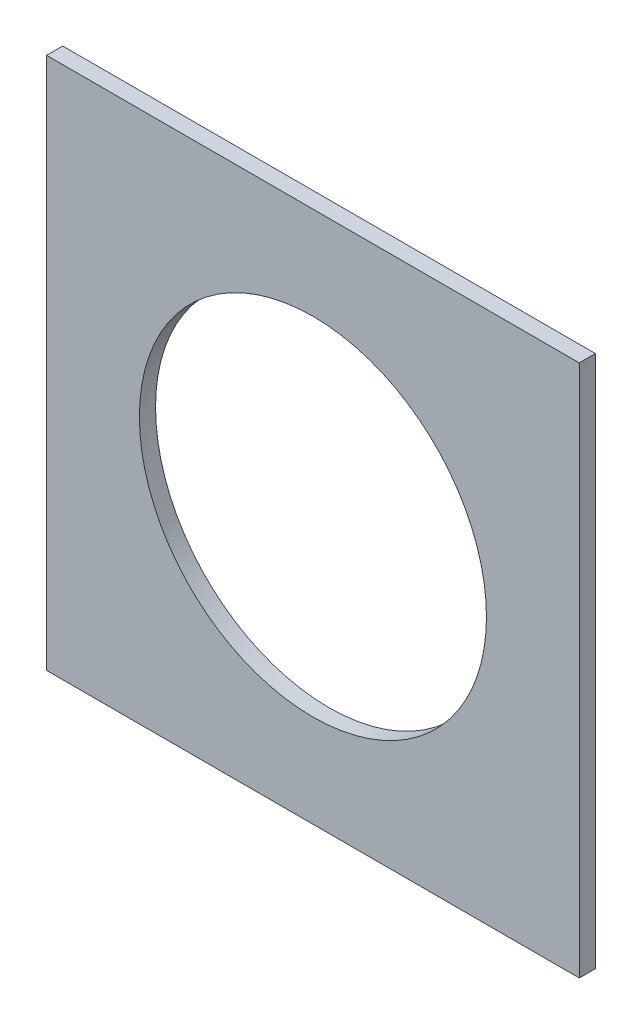
ISO-10303-21;
HEADER;
FILE_DESCRIPTION(('STEP AP214'),'2;1');
FILE_NAME('part.step','',(''),(''),'','','');
FILE_SCHEMA(('AUTOMOTIVE_DESIGN { 1 0 10303 214 1 1 1 1 }'));
ENDSEC;
DATA;
#1=APPLICATION_CONTEXT('core data for automotive mechanical design processes');
#2=APPLICATION_PROTOCOL_DEFINITION('international standard','automotive_design',2000,#1);
#3=PRODUCT_CONTEXT('',#1,'mechanical');
#4=PRODUCT('Part','Part','',(#3));
#5=PRODUCT_RELATED_PRODUCT_CATEGORY('part','',(#4));
#6=PRODUCT_DEFINITION_FORMATION('','',#4);
#7=PRODUCT_DEFINITION_CONTEXT('part definition',#1,'design');
#8=PRODUCT_DEFINITION('design','',#6,#7);
#9=PRODUCT_DEFINITION_SHAPE('','',#8);
#10=(LENGTH_UNIT() NAMED_UNIT(*) SI_UNIT(.MILLI.,.METRE.));
#11=(NAMED_UNIT(*) PLANE_ANGLE_UNIT() SI_UNIT($,.RADIAN.));
#12=(NAMED_UNIT(*) SI_UNIT($,.STERADIAN.) SOLID_ANGLE_UNIT());
#13=UNCERTAINTY_MEASURE_WITH_UNIT(LENGTH_MEASURE(1.E-05),#10,'distance_accuracy_value','');
#14=(GEOMETRIC_REPRESENTATION_CONTEXT(3) GLOBAL_UNCERTAINTY_ASSIGNED_CONTEXT((#13)) GLOBAL_UNIT_ASSIGNED_CONTEXT((#10,
#11,#12)) REPRESENTATION_CONTEXT('',''));
#15=CARTESIAN_POINT('',(0.,0.,0.));
#16=DIRECTION('',(0.,0.,1.));
#17=DIRECTION('',(1.,0.,0.));
#18=AXIS2_PLACEMENT_3D('',#15,#16,#17);
#19=CARTESIAN_POINT('',(165.,-165.,-10.));
#20=DIRECTION('',(1.,0.,0.));
#21=DIRECTION('',(0.,0.,-1.));
#22=AXIS2_PLACEMENT_3D('',#19,#20,#21);
#23=PLANE('',#22);
#24=DIRECTION('',(0.,1.,0.));
#25=VECTOR('',#24,1.);
#26=CARTESIAN_POINT('',(165.,-165.,0.));
#27=LINE('',#26,#25);
#28=CARTESIAN_POINT('',(165.,-165.,0.));
#29=VERTEX_POINT('',#28);
#30=CARTESIAN_POINT('',(165.,165.,0.));
#31=VERTEX_POINT('',#30);
#32=EDGE_CURVE('E99',#29,#31,#27,.T.);
#33=ORIENTED_EDGE('',*,*,#32,.F.);
#34=DIRECTION('',(0.,0.,1.));
#35=VECTOR('',#34,1.);
#36=CARTESIAN_POINT('',(165.,-165.,-10.));
#37=LINE('',#36,#35);
#38=CARTESIAN_POINT('',(165.,-165.,-10.));
#39=VERTEX_POINT('',#38);
#40=EDGE_CURVE('E11',#39,#29,#37,.T.);
#41=ORIENTED_EDGE('',*,*,#40,.F.);
#42=DIRECTION('',(0.,1.,0.));
#43=VECTOR('',#42,1.);
#44=CARTESIAN_POINT('',(165.,-165.,-10.));
#45=LINE('',#44,#43);
#46=CARTESIAN_POINT('',(165.,165.,-10.));
#47=VERTEX_POINT('',#46);
#48=EDGE_CURVE('E92',#39,#47,#45,.T.);
#49=ORIENTED_EDGE('',*,*,#48,.T.);
#50=DIRECTION('',(0.,0.,1.));
#51=VECTOR('',#50,1.);
#52=CARTESIAN_POINT('',(165.,165.,-10.));
#53=LINE('',#52,#51);
#54=EDGE_CURVE('E37',#47,#31,#53,.T.);
#55=ORIENTED_EDGE('',*,*,#54,.T.);
#56=EDGE_LOOP('',(#33,#41,#49,#55));
#57=FACE_BOUND('',#56,.T.);
#58=ADVANCED_FACE('F34',(#57),#23,.T.);
#59=CARTESIAN_POINT('',(-165.,-165.,-10.));
#60=DIRECTION('',(0.,-1.,0.));
#61=DIRECTION('',(0.,0.,-1.));
#62=AXIS2_PLACEMENT_3D('',#59,#60,#61);
#63=PLANE('',#62);
#64=DIRECTION('',(1.,0.,0.));
#65=VECTOR('',#64,1.);
#66=CARTESIAN_POINT('',(-165.,-165.,0.));
#67=LINE('',#66,#65);
#68=CARTESIAN_POINT('',(-165.,-165.,0.));
#69=VERTEX_POINT('',#68);
#70=EDGE_CURVE('E94',#69,#29,#67,.T.);
#71=ORIENTED_EDGE('',*,*,#70,.F.);
#72=DIRECTION('',(0.,0.,1.));
#73=VECTOR('',#72,1.);
#74=CARTESIAN_POINT('',(-165.,-165.,-10.));
#75=LINE('',#74,#73);
#76=CARTESIAN_POINT('',(-165.,-165.,-10.));
#77=VERTEX_POINT('',#76);
#78=EDGE_CURVE('E43',#77,#69,#75,.T.);
#79=ORIENTED_EDGE('',*,*,#78,.F.);
#80=DIRECTION('',(1.,0.,0.));
#81=VECTOR('',#80,1.);
#82=CARTESIAN_POINT('',(-165.,-165.,-10.));
#83=LINE('',#82,#81);
#84=EDGE_CURVE('E89',#77,#39,#83,.T.);
#85=ORIENTED_EDGE('',*,*,#84,.T.);
#86=ORIENTED_EDGE('',*,*,#40,.T.);
#87=EDGE_LOOP('',(#71,#79,#85,#86));
#88=FACE_BOUND('',#87,.T.);
#89=ADVANCED_FACE('F110',(#88),#63,.T.);
#90=CARTESIAN_POINT('',(-165.,-165.,-10.));
#91=DIRECTION('',(-1.,0.,0.));
#92=DIRECTION('',(0.,0.,1.));
#93=AXIS2_PLACEMENT_3D('',#90,#91,#92);
#94=PLANE('',#93);
#95=DIRECTION('',(0.,-1.,0.));
#96=VECTOR('',#95,1.);
#97=CARTESIAN_POINT('',(-165.,-165.,0.));
#98=LINE('',#97,#96);
#99=CARTESIAN_POINT('',(-165.,165.,0.));
#100=VERTEX_POINT('',#99);
#101=EDGE_CURVE('E84',#100,#69,#98,.T.);
#102=ORIENTED_EDGE('',*,*,#101,.F.);
#103=DIRECTION('',(0.,0.,1.));
#104=VECTOR('',#103,1.);
#105=CARTESIAN_POINT('',(-165.,165.,-10.));
#106=LINE('',#105,#104);
#107=CARTESIAN_POINT('',(-165.,165.,-10.));
#108=VERTEX_POINT('',#107);
#109=EDGE_CURVE('E79',#108,#100,#106,.T.);
#110=ORIENTED_EDGE('',*,*,#109,.F.);
#111=DIRECTION('',(0.,-1.,0.));
#112=VECTOR('',#111,1.);
#113=CARTESIAN_POINT('',(-165.,-165.,-10.));
#114=LINE('',#113,#112);
#115=EDGE_CURVE('E82',#108,#77,#114,.T.);
#116=ORIENTED_EDGE('',*,*,#115,.T.);
#117=ORIENTED_EDGE('',*,*,#78,.T.);
#118=EDGE_LOOP('',(#102,#110,#116,#117));
#119=FACE_BOUND('',#118,.T.);
#120=ADVANCED_FACE('F81',(#119),#94,.T.);
#121=CARTESIAN_POINT('',(-165.,165.,-10.));
#122=DIRECTION('',(0.,1.,0.));
#123=DIRECTION('',(0.,0.,1.));
#124=AXIS2_PLACEMENT_3D('',#121,#122,#123);
#125=PLANE('',#124);
#126=DIRECTION('',(-1.,0.,0.));
#127=VECTOR('',#126,1.);
#128=CARTESIAN_POINT('',(-165.,165.,0.));
#129=LINE('',#128,#127);
#130=EDGE_CURVE('E102',#31,#100,#129,.T.);
#131=ORIENTED_EDGE('',*,*,#130,.F.);
#132=ORIENTED_EDGE('',*,*,#54,.F.);
#133=DIRECTION('',(-1.,0.,0.));
#134=VECTOR('',#133,1.);
#135=CARTESIAN_POINT('',(-165.,165.,-10.));
#136=LINE('',#135,#134);
#137=EDGE_CURVE('E88',#47,#108,#136,.T.);
#138=ORIENTED_EDGE('',*,*,#137,.T.);
#139=ORIENTED_EDGE('',*,*,#109,.T.);
#140=EDGE_LOOP('',(#131,#132,#138,#139));
#141=FACE_BOUND('',#140,.T.);
#142=ADVANCED_FACE('F91',(#141),#125,.T.);
#143=CARTESIAN_POINT('',(0.,0.,-10.));
#144=DIRECTION('',(0.,0.,-1.));
#145=DIRECTION('',(-1.,0.,0.));
#146=AXIS2_PLACEMENT_3D('',#143,#144,#145);
#147=PLANE('',#146);
#148=CARTESIAN_POINT('',(0.,0.,-10.));
#149=DIRECTION('',(0.,0.,1.));
#150=DIRECTION('',(1.,0.,0.));
#151=AXIS2_PLACEMENT_3D('',#148,#149,#150);
#152=CIRCLE('',#151,107.5);
#153=CARTESIAN_POINT('',(107.5,0.,-10.));
#154=VERTEX_POINT('',#153);
#155=EDGE_CURVE('E103',#154,#154,#152,.T.);
#156=ORIENTED_EDGE('',*,*,#155,.T.);
#157=EDGE_LOOP('',(#156));
#158=FACE_BOUND('',#157,.T.);
#159=ORIENTED_EDGE('',*,*,#48,.F.);
#160=ORIENTED_EDGE('',*,*,#84,.F.);
#161=ORIENTED_EDGE('',*,*,#115,.F.);
#162=ORIENTED_EDGE('',*,*,#137,.F.);
#163=EDGE_LOOP('',(#159,#160,#161,#162));
#164=FACE_BOUND('',#163,.T.);
#165=ADVANCED_FACE('F87',(#158,#164),#147,.T.);
#166=CARTESIAN_POINT('',(0.,0.,0.));
#167=DIRECTION('',(0.,0.,-1.));
#168=DIRECTION('',(-1.,0.,0.));
#169=AXIS2_PLACEMENT_3D('',#166,#167,#168);
#170=PLANE('',#169);
#171=CARTESIAN_POINT('',(0.,0.,0.));
#172=DIRECTION('',(0.,0.,1.));
#173=DIRECTION('',(1.,0.,0.));
#174=AXIS2_PLACEMENT_3D('',#171,#172,#173);
#175=CIRCLE('',#174,107.5);
#176=CARTESIAN_POINT('',(107.5,0.,0.));
#177=VERTEX_POINT('',#176);
#178=EDGE_CURVE('E140',#177,#177,#175,.T.);
#179=ORIENTED_EDGE('',*,*,#178,.F.);
#180=EDGE_LOOP('',(#179));
#181=FACE_BOUND('',#180,.T.);
#182=ORIENTED_EDGE('',*,*,#32,.T.);
#183=ORIENTED_EDGE('',*,*,#130,.T.);
#184=ORIENTED_EDGE('',*,*,#101,.T.);
#185=ORIENTED_EDGE('',*,*,#70,.T.);
#186=EDGE_LOOP('',(#182,#183,#184,#185));
#187=FACE_BOUND('',#186,.T.);
#188=ADVANCED_FACE('F109',(#181,#187),#170,.F.);
#189=CARTESIAN_POINT('',(0.,0.,-10.));
#190=DIRECTION('',(0.,0.,1.));
#191=DIRECTION('',(1.,0.,0.));
#192=AXIS2_PLACEMENT_3D('',#189,#190,#191);
#193=CYLINDRICAL_SURFACE('',#192,107.5);
#194=ORIENTED_EDGE('',*,*,#155,.F.);
#195=EDGE_LOOP('',(#194));
#196=FACE_BOUND('',#195,.T.);
#197=ORIENTED_EDGE('',*,*,#178,.T.);
#198=EDGE_LOOP('',(#197));
#199=FACE_BOUND('',#198,.T.);
#200=ADVANCED_FACE('F128',(#196,#199),#193,.F.);
#201=CLOSED_SHELL('',(#58,#89,#120,#142,#165,#188,#200));
#202=MANIFOLD_SOLID_BREP('B2',#201);
#203=ADVANCED_BREP_SHAPE_REPRESENTATION('',(#18,#202),#14);
#204=SHAPE_DEFINITION_REPRESENTATION(#9,#203);
ENDSEC;
END-ISO-10303-21;
